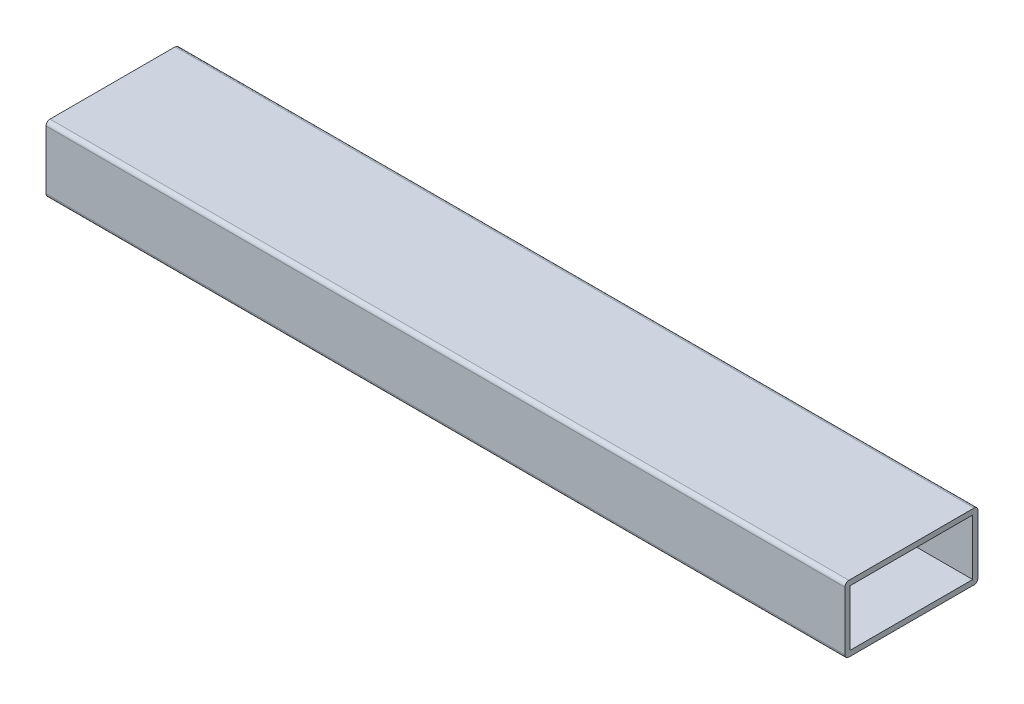
ISO-10303-21;
HEADER;
FILE_DESCRIPTION(('STEP AP214'),'2;1');
FILE_NAME('part.step','',(''),(''),'','','');
FILE_SCHEMA(('AUTOMOTIVE_DESIGN { 1 0 10303 214 1 1 1 1 }'));
ENDSEC;
DATA;
#1=APPLICATION_CONTEXT('core data for automotive mechanical design processes');
#2=APPLICATION_PROTOCOL_DEFINITION('international standard','automotive_design',2000,#1);
#3=PRODUCT_CONTEXT('',#1,'mechanical');
#4=PRODUCT('Part','Part','',(#3));
#5=PRODUCT_RELATED_PRODUCT_CATEGORY('part','',(#4));
#6=PRODUCT_DEFINITION_FORMATION('','',#4);
#7=PRODUCT_DEFINITION_CONTEXT('part definition',#1,'design');
#8=PRODUCT_DEFINITION('design','',#6,#7);
#9=PRODUCT_DEFINITION_SHAPE('','',#8);
#10=(LENGTH_UNIT() NAMED_UNIT(*) SI_UNIT(.MILLI.,.METRE.));
#11=(NAMED_UNIT(*) PLANE_ANGLE_UNIT() SI_UNIT($,.RADIAN.));
#12=(NAMED_UNIT(*) SI_UNIT($,.STERADIAN.) SOLID_ANGLE_UNIT());
#13=UNCERTAINTY_MEASURE_WITH_UNIT(LENGTH_MEASURE(1.E-05),#10,'distance_accuracy_value','');
#14=(GEOMETRIC_REPRESENTATION_CONTEXT(3) GLOBAL_UNCERTAINTY_ASSIGNED_CONTEXT((#13)) GLOBAL_UNIT_ASSIGNED_CONTEXT((#10,
#11,#12)) REPRESENTATION_CONTEXT('',''));
#15=CARTESIAN_POINT('',(0.,0.,0.));
#16=DIRECTION('',(0.,0.,1.));
#17=DIRECTION('',(1.,0.,0.));
#18=AXIS2_PLACEMENT_3D('',#15,#16,#17);
#19=CARTESIAN_POINT('',(150.,-11.,23.5));
#20=DIRECTION('',(-1.,0.,0.));
#21=DIRECTION('',(0.,0.,1.));
#22=AXIS2_PLACEMENT_3D('',#19,#20,#21);
#23=PLANE('',#22);
#24=CARTESIAN_POINT('',(150.,-11.,23.5));
#25=DIRECTION('',(1.,0.,0.));
#26=DIRECTION('',(0.,0.,1.));
#27=AXIS2_PLACEMENT_3D('',#24,#25,#26);
#28=CIRCLE('',#27,1.5);
#29=CARTESIAN_POINT('',(150.,-11.,25.));
#30=VERTEX_POINT('',#29);
#31=CARTESIAN_POINT('',(150.,-12.5,23.5));
#32=VERTEX_POINT('',#31);
#33=EDGE_CURVE('E157',#30,#32,#28,.T.);
#34=ORIENTED_EDGE('',*,*,#33,.T.);
#35=DIRECTION('',(0.,0.,-1.));
#36=VECTOR('',#35,1.);
#37=CARTESIAN_POINT('',(150.,-12.5,23.5));
#38=LINE('',#37,#36);
#39=CARTESIAN_POINT('',(150.,-12.5,-23.5));
#40=VERTEX_POINT('',#39);
#41=EDGE_CURVE('E160',#32,#40,#38,.T.);
#42=ORIENTED_EDGE('',*,*,#41,.T.);
#43=CARTESIAN_POINT('',(150.,-11.,-23.5));
#44=DIRECTION('',(1.,0.,0.));
#45=DIRECTION('',(0.,0.,-1.));
#46=AXIS2_PLACEMENT_3D('',#43,#44,#45);
#47=CIRCLE('',#46,1.5);
#48=CARTESIAN_POINT('',(150.,-11.,-25.));
#49=VERTEX_POINT('',#48);
#50=EDGE_CURVE('E163',#40,#49,#47,.T.);
#51=ORIENTED_EDGE('',*,*,#50,.T.);
#52=DIRECTION('',(0.,1.,0.));
#53=VECTOR('',#52,1.);
#54=CARTESIAN_POINT('',(150.,11.,-25.));
#55=LINE('',#54,#53);
#56=CARTESIAN_POINT('',(150.,11.,-25.));
#57=VERTEX_POINT('',#56);
#58=EDGE_CURVE('E165',#49,#57,#55,.T.);
#59=ORIENTED_EDGE('',*,*,#58,.T.);
#60=CARTESIAN_POINT('',(150.,11.,-23.5));
#61=DIRECTION('',(1.,0.,0.));
#62=DIRECTION('',(0.,0.,-1.));
#63=AXIS2_PLACEMENT_3D('',#60,#61,#62);
#64=CIRCLE('',#63,1.5);
#65=CARTESIAN_POINT('',(150.,12.5,-23.5));
#66=VERTEX_POINT('',#65);
#67=EDGE_CURVE('E167',#57,#66,#64,.T.);
#68=ORIENTED_EDGE('',*,*,#67,.T.);
#69=DIRECTION('',(0.,0.,1.));
#70=VECTOR('',#69,1.);
#71=CARTESIAN_POINT('',(150.,12.5,23.5));
#72=LINE('',#71,#70);
#73=CARTESIAN_POINT('',(150.,12.5,23.5));
#74=VERTEX_POINT('',#73);
#75=EDGE_CURVE('E169',#66,#74,#72,.T.);
#76=ORIENTED_EDGE('',*,*,#75,.T.);
#77=CARTESIAN_POINT('',(150.,11.,23.5));
#78=DIRECTION('',(1.,0.,0.));
#79=DIRECTION('',(0.,0.,1.));
#80=AXIS2_PLACEMENT_3D('',#77,#78,#79);
#81=CIRCLE('',#80,1.5);
#82=CARTESIAN_POINT('',(150.,11.,25.));
#83=VERTEX_POINT('',#82);
#84=EDGE_CURVE('E171',#74,#83,#81,.T.);
#85=ORIENTED_EDGE('',*,*,#84,.T.);
#86=DIRECTION('',(0.,-1.,0.));
#87=VECTOR('',#86,1.);
#88=CARTESIAN_POINT('',(150.,11.,25.));
#89=LINE('',#88,#87);
#90=EDGE_CURVE('E173',#83,#30,#89,.T.);
#91=ORIENTED_EDGE('',*,*,#90,.T.);
#92=EDGE_LOOP('',(#34,#42,#51,#59,#68,#76,#85,#91));
#93=FACE_BOUND('',#92,.T.);
#94=DIRECTION('',(0.,-1.,0.));
#95=VECTOR('',#94,1.);
#96=CARTESIAN_POINT('',(150.,-11.,23.));
#97=LINE('',#96,#95);
#98=CARTESIAN_POINT('',(150.,10.5,23.));
#99=VERTEX_POINT('',#98);
#100=CARTESIAN_POINT('',(150.,-10.5,23.));
#101=VERTEX_POINT('',#100);
#102=EDGE_CURVE('E126',#99,#101,#97,.T.);
#103=ORIENTED_EDGE('',*,*,#102,.F.);
#104=DIRECTION('',(0.,0.,1.));
#105=VECTOR('',#104,1.);
#106=CARTESIAN_POINT('',(150.,10.5,23.5));
#107=LINE('',#106,#105);
#108=CARTESIAN_POINT('',(150.,10.5,-23.));
#109=VERTEX_POINT('',#108);
#110=EDGE_CURVE('E153',#109,#99,#107,.T.);
#111=ORIENTED_EDGE('',*,*,#110,.F.);
#112=DIRECTION('',(0.,1.,0.));
#113=VECTOR('',#112,1.);
#114=CARTESIAN_POINT('',(150.,-11.,-23.));
#115=LINE('',#114,#113);
#116=CARTESIAN_POINT('',(150.,-10.5,-23.));
#117=VERTEX_POINT('',#116);
#118=EDGE_CURVE('E146',#117,#109,#115,.T.);
#119=ORIENTED_EDGE('',*,*,#118,.F.);
#120=DIRECTION('',(0.,0.,-1.));
#121=VECTOR('',#120,1.);
#122=CARTESIAN_POINT('',(150.,-10.5,23.5));
#123=LINE('',#122,#121);
#124=EDGE_CURVE('E144',#101,#117,#123,.T.);
#125=ORIENTED_EDGE('',*,*,#124,.F.);
#126=EDGE_LOOP('',(#103,#111,#119,#125));
#127=FACE_BOUND('',#126,.T.);
#128=ADVANCED_FACE('F33',(#93,#127),#23,.F.);
#129=CARTESIAN_POINT('',(-150.,-11.,23.5));
#130=DIRECTION('',(-1.,0.,0.));
#131=DIRECTION('',(0.,0.,1.));
#132=AXIS2_PLACEMENT_3D('',#129,#130,#131);
#133=PLANE('',#132);
#134=CARTESIAN_POINT('',(-150.,-11.,23.5));
#135=DIRECTION('',(1.,0.,0.));
#136=DIRECTION('',(0.,0.,1.));
#137=AXIS2_PLACEMENT_3D('',#134,#135,#136);
#138=CIRCLE('',#137,1.5);
#139=CARTESIAN_POINT('',(-150.,-11.,25.));
#140=VERTEX_POINT('',#139);
#141=CARTESIAN_POINT('',(-150.,-12.5,23.5));
#142=VERTEX_POINT('',#141);
#143=EDGE_CURVE('E129',#140,#142,#138,.T.);
#144=ORIENTED_EDGE('',*,*,#143,.F.);
#145=DIRECTION('',(0.,-1.,0.));
#146=VECTOR('',#145,1.);
#147=CARTESIAN_POINT('',(-150.,11.,25.));
#148=LINE('',#147,#146);
#149=CARTESIAN_POINT('',(-150.,11.,25.));
#150=VERTEX_POINT('',#149);
#151=EDGE_CURVE('E161',#150,#140,#148,.T.);
#152=ORIENTED_EDGE('',*,*,#151,.F.);
#153=CARTESIAN_POINT('',(-150.,11.,23.5));
#154=DIRECTION('',(1.,0.,0.));
#155=DIRECTION('',(0.,0.,1.));
#156=AXIS2_PLACEMENT_3D('',#153,#154,#155);
#157=CIRCLE('',#156,1.5);
#158=CARTESIAN_POINT('',(-150.,12.5,23.5));
#159=VERTEX_POINT('',#158);
#160=EDGE_CURVE('E188',#159,#150,#157,.T.);
#161=ORIENTED_EDGE('',*,*,#160,.F.);
#162=DIRECTION('',(0.,0.,1.));
#163=VECTOR('',#162,1.);
#164=CARTESIAN_POINT('',(-150.,12.5,23.5));
#165=LINE('',#164,#163);
#166=CARTESIAN_POINT('',(-150.,12.5,-23.5));
#167=VERTEX_POINT('',#166);
#168=EDGE_CURVE('E186',#167,#159,#165,.T.);
#169=ORIENTED_EDGE('',*,*,#168,.F.);
#170=CARTESIAN_POINT('',(-150.,11.,-23.5));
#171=DIRECTION('',(1.,0.,0.));
#172=DIRECTION('',(0.,0.,-1.));
#173=AXIS2_PLACEMENT_3D('',#170,#171,#172);
#174=CIRCLE('',#173,1.5);
#175=CARTESIAN_POINT('',(-150.,11.,-25.));
#176=VERTEX_POINT('',#175);
#177=EDGE_CURVE('E184',#176,#167,#174,.T.);
#178=ORIENTED_EDGE('',*,*,#177,.F.);
#179=DIRECTION('',(0.,1.,0.));
#180=VECTOR('',#179,1.);
#181=CARTESIAN_POINT('',(-150.,11.,-25.));
#182=LINE('',#181,#180);
#183=CARTESIAN_POINT('',(-150.,-11.,-25.));
#184=VERTEX_POINT('',#183);
#185=EDGE_CURVE('E182',#184,#176,#182,.T.);
#186=ORIENTED_EDGE('',*,*,#185,.F.);
#187=CARTESIAN_POINT('',(-150.,-11.,-23.5));
#188=DIRECTION('',(1.,0.,0.));
#189=DIRECTION('',(0.,0.,-1.));
#190=AXIS2_PLACEMENT_3D('',#187,#188,#189);
#191=CIRCLE('',#190,1.5);
#192=CARTESIAN_POINT('',(-150.,-12.5,-23.5));
#193=VERTEX_POINT('',#192);
#194=EDGE_CURVE('E180',#193,#184,#191,.T.);
#195=ORIENTED_EDGE('',*,*,#194,.F.);
#196=DIRECTION('',(0.,0.,-1.));
#197=VECTOR('',#196,1.);
#198=CARTESIAN_POINT('',(-150.,-12.5,23.5));
#199=LINE('',#198,#197);
#200=EDGE_CURVE('E178',#142,#193,#199,.T.);
#201=ORIENTED_EDGE('',*,*,#200,.F.);
#202=EDGE_LOOP('',(#144,#152,#161,#169,#178,#186,#195,#201));
#203=FACE_BOUND('',#202,.T.);
#204=DIRECTION('',(0.,-1.,0.));
#205=VECTOR('',#204,1.);
#206=CARTESIAN_POINT('',(-150.,-11.,23.));
#207=LINE('',#206,#205);
#208=CARTESIAN_POINT('',(-150.,10.5,23.));
#209=VERTEX_POINT('',#208);
#210=CARTESIAN_POINT('',(-150.,-10.5,23.));
#211=VERTEX_POINT('',#210);
#212=EDGE_CURVE('E123',#209,#211,#207,.T.);
#213=ORIENTED_EDGE('',*,*,#212,.T.);
#214=DIRECTION('',(0.,0.,-1.));
#215=VECTOR('',#214,1.);
#216=CARTESIAN_POINT('',(-150.,-10.5,23.5));
#217=LINE('',#216,#215);
#218=CARTESIAN_POINT('',(-150.,-10.5,-23.));
#219=VERTEX_POINT('',#218);
#220=EDGE_CURVE('E134',#211,#219,#217,.T.);
#221=ORIENTED_EDGE('',*,*,#220,.T.);
#222=DIRECTION('',(0.,1.,0.));
#223=VECTOR('',#222,1.);
#224=CARTESIAN_POINT('',(-150.,-11.,-23.));
#225=LINE('',#224,#223);
#226=CARTESIAN_POINT('',(-150.,10.5,-23.));
#227=VERTEX_POINT('',#226);
#228=EDGE_CURVE('E139',#219,#227,#225,.T.);
#229=ORIENTED_EDGE('',*,*,#228,.T.);
#230=DIRECTION('',(0.,0.,1.));
#231=VECTOR('',#230,1.);
#232=CARTESIAN_POINT('',(-150.,10.5,23.5));
#233=LINE('',#232,#231);
#234=EDGE_CURVE('E143',#227,#209,#233,.T.);
#235=ORIENTED_EDGE('',*,*,#234,.T.);
#236=EDGE_LOOP('',(#213,#221,#229,#235));
#237=FACE_BOUND('',#236,.T.);
#238=ADVANCED_FACE('F142',(#203,#237),#133,.T.);
#239=CARTESIAN_POINT('',(150.,-11.,23.5));
#240=DIRECTION('',(-1.,0.,0.));
#241=DIRECTION('',(0.,0.,1.));
#242=AXIS2_PLACEMENT_3D('',#239,#240,#241);
#243=CYLINDRICAL_SURFACE('',#242,1.5);
#244=ORIENTED_EDGE('',*,*,#143,.T.);
#245=DIRECTION('',(-1.,0.,0.));
#246=VECTOR('',#245,1.);
#247=CARTESIAN_POINT('',(150.,-12.5,23.5));
#248=LINE('',#247,#246);
#249=EDGE_CURVE('E11',#32,#142,#248,.T.);
#250=ORIENTED_EDGE('',*,*,#249,.F.);
#251=ORIENTED_EDGE('',*,*,#33,.F.);
#252=DIRECTION('',(-1.,0.,0.));
#253=VECTOR('',#252,1.);
#254=CARTESIAN_POINT('',(150.,-11.,25.));
#255=LINE('',#254,#253);
#256=EDGE_CURVE('E175',#30,#140,#255,.T.);
#257=ORIENTED_EDGE('',*,*,#256,.T.);
#258=EDGE_LOOP('',(#244,#250,#251,#257));
#259=FACE_BOUND('',#258,.T.);
#260=ADVANCED_FACE('F35',(#259),#243,.T.);
#261=CARTESIAN_POINT('',(150.,-12.5,23.5));
#262=DIRECTION('',(0.,1.,0.));
#263=DIRECTION('',(0.,0.,1.));
#264=AXIS2_PLACEMENT_3D('',#261,#262,#263);
#265=PLANE('',#264);
#266=ORIENTED_EDGE('',*,*,#200,.T.);
#267=DIRECTION('',(-1.,0.,0.));
#268=VECTOR('',#267,1.);
#269=CARTESIAN_POINT('',(150.,-12.5,-23.5));
#270=LINE('',#269,#268);
#271=EDGE_CURVE('E41',#40,#193,#270,.T.);
#272=ORIENTED_EDGE('',*,*,#271,.F.);
#273=ORIENTED_EDGE('',*,*,#41,.F.);
#274=ORIENTED_EDGE('',*,*,#249,.T.);
#275=EDGE_LOOP('',(#266,#272,#273,#274));
#276=FACE_BOUND('',#275,.T.);
#277=ADVANCED_FACE('F234',(#276),#265,.F.);
#278=CARTESIAN_POINT('',(150.,-11.,-23.5));
#279=DIRECTION('',(-1.,0.,0.));
#280=DIRECTION('',(0.,0.,1.));
#281=AXIS2_PLACEMENT_3D('',#278,#279,#280);
#282=CYLINDRICAL_SURFACE('',#281,1.5);
#283=ORIENTED_EDGE('',*,*,#194,.T.);
#284=DIRECTION('',(-1.,0.,0.));
#285=VECTOR('',#284,1.);
#286=CARTESIAN_POINT('',(150.,-11.,-25.));
#287=LINE('',#286,#285);
#288=EDGE_CURVE('E205',#49,#184,#287,.T.);
#289=ORIENTED_EDGE('',*,*,#288,.F.);
#290=ORIENTED_EDGE('',*,*,#50,.F.);
#291=ORIENTED_EDGE('',*,*,#271,.T.);
#292=EDGE_LOOP('',(#283,#289,#290,#291));
#293=FACE_BOUND('',#292,.T.);
#294=ADVANCED_FACE('F212',(#293),#282,.T.);
#295=CARTESIAN_POINT('',(150.,11.,-25.));
#296=DIRECTION('',(0.,0.,1.));
#297=DIRECTION('',(0.,-1.,0.));
#298=AXIS2_PLACEMENT_3D('',#295,#296,#297);
#299=PLANE('',#298);
#300=ORIENTED_EDGE('',*,*,#185,.T.);
#301=DIRECTION('',(-1.,0.,0.));
#302=VECTOR('',#301,1.);
#303=CARTESIAN_POINT('',(150.,11.,-25.));
#304=LINE('',#303,#302);
#305=EDGE_CURVE('E202',#57,#176,#304,.T.);
#306=ORIENTED_EDGE('',*,*,#305,.F.);
#307=ORIENTED_EDGE('',*,*,#58,.F.);
#308=ORIENTED_EDGE('',*,*,#288,.T.);
#309=EDGE_LOOP('',(#300,#306,#307,#308));
#310=FACE_BOUND('',#309,.T.);
#311=ADVANCED_FACE('F222',(#310),#299,.F.);
#312=CARTESIAN_POINT('',(150.,11.,-23.5));
#313=DIRECTION('',(-1.,0.,0.));
#314=DIRECTION('',(0.,0.,1.));
#315=AXIS2_PLACEMENT_3D('',#312,#313,#314);
#316=CYLINDRICAL_SURFACE('',#315,1.5);
#317=ORIENTED_EDGE('',*,*,#177,.T.);
#318=DIRECTION('',(-1.,0.,0.));
#319=VECTOR('',#318,1.);
#320=CARTESIAN_POINT('',(150.,12.5,-23.5));
#321=LINE('',#320,#319);
#322=EDGE_CURVE('E199',#66,#167,#321,.T.);
#323=ORIENTED_EDGE('',*,*,#322,.F.);
#324=ORIENTED_EDGE('',*,*,#67,.F.);
#325=ORIENTED_EDGE('',*,*,#305,.T.);
#326=EDGE_LOOP('',(#317,#323,#324,#325));
#327=FACE_BOUND('',#326,.T.);
#328=ADVANCED_FACE('F226',(#327),#316,.T.);
#329=CARTESIAN_POINT('',(150.,12.5,23.5));
#330=DIRECTION('',(0.,-1.,0.));
#331=DIRECTION('',(0.,0.,-1.));
#332=AXIS2_PLACEMENT_3D('',#329,#330,#331);
#333=PLANE('',#332);
#334=ORIENTED_EDGE('',*,*,#168,.T.);
#335=DIRECTION('',(-1.,0.,0.));
#336=VECTOR('',#335,1.);
#337=CARTESIAN_POINT('',(150.,12.5,23.5));
#338=LINE('',#337,#336);
#339=EDGE_CURVE('E196',#74,#159,#338,.T.);
#340=ORIENTED_EDGE('',*,*,#339,.F.);
#341=ORIENTED_EDGE('',*,*,#75,.F.);
#342=ORIENTED_EDGE('',*,*,#322,.T.);
#343=EDGE_LOOP('',(#334,#340,#341,#342));
#344=FACE_BOUND('',#343,.T.);
#345=ADVANCED_FACE('F247',(#344),#333,.F.);
#346=CARTESIAN_POINT('',(150.,11.,23.5));
#347=DIRECTION('',(-1.,0.,0.));
#348=DIRECTION('',(0.,0.,1.));
#349=AXIS2_PLACEMENT_3D('',#346,#347,#348);
#350=CYLINDRICAL_SURFACE('',#349,1.5);
#351=ORIENTED_EDGE('',*,*,#160,.T.);
#352=DIRECTION('',(-1.,0.,0.));
#353=VECTOR('',#352,1.);
#354=CARTESIAN_POINT('',(150.,11.,25.));
#355=LINE('',#354,#353);
#356=EDGE_CURVE('E193',#83,#150,#355,.T.);
#357=ORIENTED_EDGE('',*,*,#356,.F.);
#358=ORIENTED_EDGE('',*,*,#84,.F.);
#359=ORIENTED_EDGE('',*,*,#339,.T.);
#360=EDGE_LOOP('',(#351,#357,#358,#359));
#361=FACE_BOUND('',#360,.T.);
#362=ADVANCED_FACE('F245',(#361),#350,.T.);
#363=CARTESIAN_POINT('',(150.,11.,25.));
#364=DIRECTION('',(0.,0.,-1.));
#365=DIRECTION('',(0.,1.,0.));
#366=AXIS2_PLACEMENT_3D('',#363,#364,#365);
#367=PLANE('',#366);
#368=ORIENTED_EDGE('',*,*,#151,.T.);
#369=ORIENTED_EDGE('',*,*,#256,.F.);
#370=ORIENTED_EDGE('',*,*,#90,.F.);
#371=ORIENTED_EDGE('',*,*,#356,.T.);
#372=EDGE_LOOP('',(#368,#369,#370,#371));
#373=FACE_BOUND('',#372,.T.);
#374=ADVANCED_FACE('F240',(#373),#367,.F.);
#375=CARTESIAN_POINT('',(150.,-10.5,23.5));
#376=DIRECTION('',(0.,1.,0.));
#377=DIRECTION('',(0.,0.,1.));
#378=AXIS2_PLACEMENT_3D('',#375,#376,#377);
#379=PLANE('',#378);
#380=ORIENTED_EDGE('',*,*,#220,.F.);
#381=DIRECTION('',(-1.,0.,0.));
#382=VECTOR('',#381,1.);
#383=CARTESIAN_POINT('',(150.,-10.5,23.));
#384=LINE('',#383,#382);
#385=EDGE_CURVE('E118',#101,#211,#384,.T.);
#386=ORIENTED_EDGE('',*,*,#385,.F.);
#387=ORIENTED_EDGE('',*,*,#124,.T.);
#388=DIRECTION('',(-1.,0.,0.));
#389=VECTOR('',#388,1.);
#390=CARTESIAN_POINT('',(150.,-10.5,-23.));
#391=LINE('',#390,#389);
#392=EDGE_CURVE('E130',#117,#219,#391,.T.);
#393=ORIENTED_EDGE('',*,*,#392,.T.);
#394=EDGE_LOOP('',(#380,#386,#387,#393));
#395=FACE_BOUND('',#394,.T.);
#396=ADVANCED_FACE('F135',(#395),#379,.T.);
#397=CARTESIAN_POINT('',(150.,11.,-23.));
#398=DIRECTION('',(0.,0.,1.));
#399=DIRECTION('',(0.,-1.,0.));
#400=AXIS2_PLACEMENT_3D('',#397,#398,#399);
#401=PLANE('',#400);
#402=ORIENTED_EDGE('',*,*,#228,.F.);
#403=ORIENTED_EDGE('',*,*,#392,.F.);
#404=ORIENTED_EDGE('',*,*,#118,.T.);
#405=DIRECTION('',(-1.,0.,0.));
#406=VECTOR('',#405,1.);
#407=CARTESIAN_POINT('',(150.,10.5,-23.));
#408=LINE('',#407,#406);
#409=EDGE_CURVE('E48',#109,#227,#408,.T.);
#410=ORIENTED_EDGE('',*,*,#409,.T.);
#411=EDGE_LOOP('',(#402,#403,#404,#410));
#412=FACE_BOUND('',#411,.T.);
#413=ADVANCED_FACE('F269',(#412),#401,.T.);
#414=CARTESIAN_POINT('',(150.,10.5,23.5));
#415=DIRECTION('',(0.,-1.,0.));
#416=DIRECTION('',(0.,0.,-1.));
#417=AXIS2_PLACEMENT_3D('',#414,#415,#416);
#418=PLANE('',#417);
#419=ORIENTED_EDGE('',*,*,#234,.F.);
#420=ORIENTED_EDGE('',*,*,#409,.F.);
#421=ORIENTED_EDGE('',*,*,#110,.T.);
#422=DIRECTION('',(-1.,0.,0.));
#423=VECTOR('',#422,1.);
#424=CARTESIAN_POINT('',(150.,10.5,23.));
#425=LINE('',#424,#423);
#426=EDGE_CURVE('E156',#99,#209,#425,.T.);
#427=ORIENTED_EDGE('',*,*,#426,.T.);
#428=EDGE_LOOP('',(#419,#420,#421,#427));
#429=FACE_BOUND('',#428,.T.);
#430=ADVANCED_FACE('F274',(#429),#418,.T.);
#431=CARTESIAN_POINT('',(150.,11.,23.));
#432=DIRECTION('',(0.,0.,-1.));
#433=DIRECTION('',(0.,1.,0.));
#434=AXIS2_PLACEMENT_3D('',#431,#432,#433);
#435=PLANE('',#434);
#436=ORIENTED_EDGE('',*,*,#212,.F.);
#437=ORIENTED_EDGE('',*,*,#426,.F.);
#438=ORIENTED_EDGE('',*,*,#102,.T.);
#439=ORIENTED_EDGE('',*,*,#385,.T.);
#440=EDGE_LOOP('',(#436,#437,#438,#439));
#441=FACE_BOUND('',#440,.T.);
#442=ADVANCED_FACE('F120',(#441),#435,.T.);
#443=CLOSED_SHELL('',(#128,#238,#260,#277,#294,#311,#328,#345,#362,#374,#396,#413,#430,#442));
#444=MANIFOLD_SOLID_BREP('B2',#443);
#445=ADVANCED_BREP_SHAPE_REPRESENTATION('',(#18,#444),#14);
#446=SHAPE_DEFINITION_REPRESENTATION(#9,#445);
ENDSEC;
END-ISO-10303-21;
